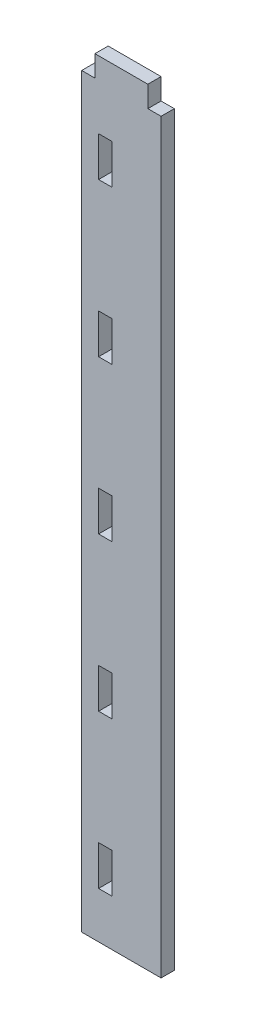
ISO-10303-21;
HEADER;
FILE_DESCRIPTION(('STEP AP214'),'2;1');
FILE_NAME('part.step','',(''),(''),'','','');
FILE_SCHEMA(('AUTOMOTIVE_DESIGN { 1 0 10303 214 1 1 1 1 }'));
ENDSEC;
DATA;
#1=APPLICATION_CONTEXT('core data for automotive mechanical design processes');
#2=APPLICATION_PROTOCOL_DEFINITION('international standard','automotive_design',2000,#1);
#3=PRODUCT_CONTEXT('',#1,'mechanical');
#4=PRODUCT('Part','Part','',(#3));
#5=PRODUCT_RELATED_PRODUCT_CATEGORY('part','',(#4));
#6=PRODUCT_DEFINITION_FORMATION('','',#4);
#7=PRODUCT_DEFINITION_CONTEXT('part definition',#1,'design');
#8=PRODUCT_DEFINITION('design','',#6,#7);
#9=PRODUCT_DEFINITION_SHAPE('','',#8);
#10=(LENGTH_UNIT() NAMED_UNIT(*) SI_UNIT(.MILLI.,.METRE.));
#11=(NAMED_UNIT(*) PLANE_ANGLE_UNIT() SI_UNIT($,.RADIAN.));
#12=(NAMED_UNIT(*) SI_UNIT($,.STERADIAN.) SOLID_ANGLE_UNIT());
#13=UNCERTAINTY_MEASURE_WITH_UNIT(LENGTH_MEASURE(1.E-05),#10,'distance_accuracy_value','');
#14=(GEOMETRIC_REPRESENTATION_CONTEXT(3) GLOBAL_UNCERTAINTY_ASSIGNED_CONTEXT((#13)) GLOBAL_UNIT_ASSIGNED_CONTEXT((#10,
#11,#12)) REPRESENTATION_CONTEXT('',''));
#15=CARTESIAN_POINT('',(0.,0.,0.));
#16=DIRECTION('',(0.,0.,1.));
#17=DIRECTION('',(1.,0.,0.));
#18=AXIS2_PLACEMENT_3D('',#15,#16,#17);
#19=CARTESIAN_POINT('',(0.,0.,5.));
#20=DIRECTION('',(0.,0.,1.));
#21=DIRECTION('',(1.,0.,0.));
#22=AXIS2_PLACEMENT_3D('',#19,#20,#21);
#23=PLANE('',#22);
#24=DIRECTION('',(0.,1.,0.));
#25=VECTOR('',#24,1.);
#26=CARTESIAN_POINT('',(-18.61,75.5,5.));
#27=LINE('',#26,#25);
#28=CARTESIAN_POINT('',(-18.61,75.5,5.));
#29=VERTEX_POINT('',#28);
#30=CARTESIAN_POINT('',(-18.61,90.5,5.));
#31=VERTEX_POINT('',#30);
#32=EDGE_CURVE('E278',#29,#31,#27,.T.);
#33=ORIENTED_EDGE('',*,*,#32,.F.);
#34=DIRECTION('',(1.,0.,0.));
#35=VECTOR('',#34,1.);
#36=CARTESIAN_POINT('',(-23.61,75.5,5.));
#37=LINE('',#36,#35);
#38=CARTESIAN_POINT('',(-23.61,75.5,5.));
#39=VERTEX_POINT('',#38);
#40=EDGE_CURVE('E263',#39,#29,#37,.T.);
#41=ORIENTED_EDGE('',*,*,#40,.F.);
#42=DIRECTION('',(0.,1.,0.));
#43=VECTOR('',#42,1.);
#44=CARTESIAN_POINT('',(-23.61,75.5,5.));
#45=LINE('',#44,#43);
#46=CARTESIAN_POINT('',(-23.61,90.5,5.));
#47=VERTEX_POINT('',#46);
#48=EDGE_CURVE('E258',#39,#47,#45,.T.);
#49=ORIENTED_EDGE('',*,*,#48,.T.);
#50=DIRECTION('',(1.,0.,0.));
#51=VECTOR('',#50,1.);
#52=CARTESIAN_POINT('',(-23.61,90.5,5.));
#53=LINE('',#52,#51);
#54=EDGE_CURVE('E275',#47,#31,#53,.T.);
#55=ORIENTED_EDGE('',*,*,#54,.T.);
#56=EDGE_LOOP('',(#33,#41,#49,#55));
#57=FACE_BOUND('',#56,.T.);
#58=DIRECTION('',(0.,1.,0.));
#59=VECTOR('',#58,1.);
#60=CARTESIAN_POINT('',(-18.61,191.5,5.));
#61=LINE('',#60,#59);
#62=CARTESIAN_POINT('',(-18.61,191.5,5.));
#63=VERTEX_POINT('',#62);
#64=CARTESIAN_POINT('',(-18.61,206.5,5.));
#65=VERTEX_POINT('',#64);
#66=EDGE_CURVE('E342',#63,#65,#61,.T.);
#67=ORIENTED_EDGE('',*,*,#66,.F.);
#68=DIRECTION('',(1.,0.,0.));
#69=VECTOR('',#68,1.);
#70=CARTESIAN_POINT('',(-23.61,191.5,5.));
#71=LINE('',#70,#69);
#72=CARTESIAN_POINT('',(-23.61,191.5,5.));
#73=VERTEX_POINT('',#72);
#74=EDGE_CURVE('E327',#73,#63,#71,.T.);
#75=ORIENTED_EDGE('',*,*,#74,.F.);
#76=DIRECTION('',(0.,1.,0.));
#77=VECTOR('',#76,1.);
#78=CARTESIAN_POINT('',(-23.61,191.5,5.));
#79=LINE('',#78,#77);
#80=CARTESIAN_POINT('',(-23.61,206.5,5.));
#81=VERTEX_POINT('',#80);
#82=EDGE_CURVE('E322',#73,#81,#79,.T.);
#83=ORIENTED_EDGE('',*,*,#82,.T.);
#84=DIRECTION('',(1.,0.,0.));
#85=VECTOR('',#84,1.);
#86=CARTESIAN_POINT('',(-23.61,206.5,5.));
#87=LINE('',#86,#85);
#88=EDGE_CURVE('E339',#81,#65,#87,.T.);
#89=ORIENTED_EDGE('',*,*,#88,.T.);
#90=EDGE_LOOP('',(#67,#75,#83,#89));
#91=FACE_BOUND('',#90,.T.);
#92=DIRECTION('',(0.,-1.,0.));
#93=VECTOR('',#92,1.);
#94=CARTESIAN_POINT('',(-25.,290.,5.));
#95=LINE('',#94,#93);
#96=CARTESIAN_POINT('',(-25.,290.,5.));
#97=VERTEX_POINT('',#96);
#98=CARTESIAN_POINT('',(-25.,282.,5.));
#99=VERTEX_POINT('',#98);
#100=EDGE_CURVE('E379',#97,#99,#95,.T.);
#101=ORIENTED_EDGE('',*,*,#100,.T.);
#102=DIRECTION('',(1.,0.,0.));
#103=VECTOR('',#102,1.);
#104=CARTESIAN_POINT('',(-30.,282.,5.));
#105=LINE('',#104,#103);
#106=CARTESIAN_POINT('',(-30.,282.,5.));
#107=VERTEX_POINT('',#106);
#108=EDGE_CURVE('E377',#107,#99,#105,.T.);
#109=ORIENTED_EDGE('',*,*,#108,.F.);
#110=DIRECTION('',(0.,1.,0.));
#111=VECTOR('',#110,1.);
#112=CARTESIAN_POINT('',(-30.,0.,5.));
#113=LINE('',#112,#111);
#114=CARTESIAN_POINT('',(-30.,0.,5.));
#115=VERTEX_POINT('',#114);
#116=EDGE_CURVE('E420',#115,#107,#113,.T.);
#117=ORIENTED_EDGE('',*,*,#116,.F.);
#118=DIRECTION('',(-1.,0.,0.));
#119=VECTOR('',#118,1.);
#120=CARTESIAN_POINT('',(0.,0.,5.));
#121=LINE('',#120,#119);
#122=CARTESIAN_POINT('',(0.,0.,5.));
#123=VERTEX_POINT('',#122);
#124=EDGE_CURVE('E423',#123,#115,#121,.T.);
#125=ORIENTED_EDGE('',*,*,#124,.F.);
#126=DIRECTION('',(0.,1.,0.));
#127=VECTOR('',#126,1.);
#128=CARTESIAN_POINT('',(0.,0.,5.));
#129=LINE('',#128,#127);
#130=CARTESIAN_POINT('',(0.,282.,5.));
#131=VERTEX_POINT('',#130);
#132=EDGE_CURVE('E413',#123,#131,#129,.T.);
#133=ORIENTED_EDGE('',*,*,#132,.T.);
#134=DIRECTION('',(-1.,0.,0.));
#135=VECTOR('',#134,1.);
#136=CARTESIAN_POINT('',(0.,282.,5.));
#137=LINE('',#136,#135);
#138=CARTESIAN_POINT('',(-5.00000000000001,282.,5.));
#139=VERTEX_POINT('',#138);
#140=EDGE_CURVE('E395',#131,#139,#137,.T.);
#141=ORIENTED_EDGE('',*,*,#140,.T.);
#142=DIRECTION('',(0.,-1.,0.));
#143=VECTOR('',#142,1.);
#144=CARTESIAN_POINT('',(-5.00000000000001,290.,5.));
#145=LINE('',#144,#143);
#146=CARTESIAN_POINT('',(-5.00000000000001,290.,5.));
#147=VERTEX_POINT('',#146);
#148=EDGE_CURVE('E398',#147,#139,#145,.T.);
#149=ORIENTED_EDGE('',*,*,#148,.F.);
#150=DIRECTION('',(-1.,0.,0.));
#151=VECTOR('',#150,1.);
#152=CARTESIAN_POINT('',(0.,290.,5.));
#153=LINE('',#152,#151);
#154=EDGE_CURVE('E416',#147,#97,#153,.T.);
#155=ORIENTED_EDGE('',*,*,#154,.T.);
#156=EDGE_LOOP('',(#101,#109,#117,#125,#133,#141,#149,#155));
#157=FACE_BOUND('',#156,.T.);
#158=DIRECTION('',(0.,1.,0.));
#159=VECTOR('',#158,1.);
#160=CARTESIAN_POINT('',(-18.61,249.5,5.));
#161=LINE('',#160,#159);
#162=CARTESIAN_POINT('',(-18.61,249.5,5.));
#163=VERTEX_POINT('',#162);
#164=CARTESIAN_POINT('',(-18.61,264.5,5.));
#165=VERTEX_POINT('',#164);
#166=EDGE_CURVE('E374',#163,#165,#161,.T.);
#167=ORIENTED_EDGE('',*,*,#166,.F.);
#168=DIRECTION('',(1.,0.,0.));
#169=VECTOR('',#168,1.);
#170=CARTESIAN_POINT('',(-23.61,249.5,5.));
#171=LINE('',#170,#169);
#172=CARTESIAN_POINT('',(-23.61,249.5,5.));
#173=VERTEX_POINT('',#172);
#174=EDGE_CURVE('E359',#173,#163,#171,.T.);
#175=ORIENTED_EDGE('',*,*,#174,.F.);
#176=DIRECTION('',(0.,1.,0.));
#177=VECTOR('',#176,1.);
#178=CARTESIAN_POINT('',(-23.61,249.5,5.));
#179=LINE('',#178,#177);
#180=CARTESIAN_POINT('',(-23.61,264.5,5.));
#181=VERTEX_POINT('',#180);
#182=EDGE_CURVE('E354',#173,#181,#179,.T.);
#183=ORIENTED_EDGE('',*,*,#182,.T.);
#184=DIRECTION('',(1.,0.,0.));
#185=VECTOR('',#184,1.);
#186=CARTESIAN_POINT('',(-23.61,264.5,5.));
#187=LINE('',#186,#185);
#188=EDGE_CURVE('E371',#181,#165,#187,.T.);
#189=ORIENTED_EDGE('',*,*,#188,.T.);
#190=EDGE_LOOP('',(#167,#175,#183,#189));
#191=FACE_BOUND('',#190,.T.);
#192=DIRECTION('',(0.,1.,0.));
#193=VECTOR('',#192,1.);
#194=CARTESIAN_POINT('',(-18.61,133.5,5.));
#195=LINE('',#194,#193);
#196=CARTESIAN_POINT('',(-18.61,133.5,5.));
#197=VERTEX_POINT('',#196);
#198=CARTESIAN_POINT('',(-18.61,148.5,5.));
#199=VERTEX_POINT('',#198);
#200=EDGE_CURVE('E310',#197,#199,#195,.T.);
#201=ORIENTED_EDGE('',*,*,#200,.F.);
#202=DIRECTION('',(1.,0.,0.));
#203=VECTOR('',#202,1.);
#204=CARTESIAN_POINT('',(-23.61,133.5,5.));
#205=LINE('',#204,#203);
#206=CARTESIAN_POINT('',(-23.61,133.5,5.));
#207=VERTEX_POINT('',#206);
#208=EDGE_CURVE('E295',#207,#197,#205,.T.);
#209=ORIENTED_EDGE('',*,*,#208,.F.);
#210=DIRECTION('',(0.,1.,0.));
#211=VECTOR('',#210,1.);
#212=CARTESIAN_POINT('',(-23.61,133.5,5.));
#213=LINE('',#212,#211);
#214=CARTESIAN_POINT('',(-23.61,148.5,5.));
#215=VERTEX_POINT('',#214);
#216=EDGE_CURVE('E290',#207,#215,#213,.T.);
#217=ORIENTED_EDGE('',*,*,#216,.T.);
#218=DIRECTION('',(1.,0.,0.));
#219=VECTOR('',#218,1.);
#220=CARTESIAN_POINT('',(-23.61,148.5,5.));
#221=LINE('',#220,#219);
#222=EDGE_CURVE('E307',#215,#199,#221,.T.);
#223=ORIENTED_EDGE('',*,*,#222,.T.);
#224=EDGE_LOOP('',(#201,#209,#217,#223));
#225=FACE_BOUND('',#224,.T.);
#226=DIRECTION('',(0.,1.,0.));
#227=VECTOR('',#226,1.);
#228=CARTESIAN_POINT('',(-18.61,17.5,5.));
#229=LINE('',#228,#227);
#230=CARTESIAN_POINT('',(-18.61,17.5,5.));
#231=VERTEX_POINT('',#230);
#232=CARTESIAN_POINT('',(-18.61,32.5,5.));
#233=VERTEX_POINT('',#232);
#234=EDGE_CURVE('E246',#231,#233,#229,.T.);
#235=ORIENTED_EDGE('',*,*,#234,.F.);
#236=DIRECTION('',(1.,0.,0.));
#237=VECTOR('',#236,1.);
#238=CARTESIAN_POINT('',(-23.61,17.5,5.));
#239=LINE('',#238,#237);
#240=CARTESIAN_POINT('',(-23.61,17.5,5.));
#241=VERTEX_POINT('',#240);
#242=EDGE_CURVE('E233',#241,#231,#239,.T.);
#243=ORIENTED_EDGE('',*,*,#242,.F.);
#244=DIRECTION('',(0.,1.,0.));
#245=VECTOR('',#244,1.);
#246=CARTESIAN_POINT('',(-23.61,17.5,5.));
#247=LINE('',#246,#245);
#248=CARTESIAN_POINT('',(-23.61,32.5,5.));
#249=VERTEX_POINT('',#248);
#250=EDGE_CURVE('E243',#241,#249,#247,.T.);
#251=ORIENTED_EDGE('',*,*,#250,.T.);
#252=DIRECTION('',(1.,0.,0.));
#253=VECTOR('',#252,1.);
#254=CARTESIAN_POINT('',(-23.61,32.5,5.));
#255=LINE('',#254,#253);
#256=EDGE_CURVE('E48',#249,#233,#255,.T.);
#257=ORIENTED_EDGE('',*,*,#256,.T.);
#258=EDGE_LOOP('',(#235,#243,#251,#257));
#259=FACE_BOUND('',#258,.T.);
#260=ADVANCED_FACE('F33',(#57,#91,#157,#191,#225,#259),#23,.T.);
#261=CARTESIAN_POINT('',(0.,0.,0.));
#262=DIRECTION('',(0.,0.,1.));
#263=DIRECTION('',(1.,0.,0.));
#264=AXIS2_PLACEMENT_3D('',#261,#262,#263);
#265=PLANE('',#264);
#266=DIRECTION('',(1.,0.,0.));
#267=VECTOR('',#266,1.);
#268=CARTESIAN_POINT('',(-23.61,75.5,0.));
#269=LINE('',#268,#267);
#270=CARTESIAN_POINT('',(-23.61,75.5,0.));
#271=VERTEX_POINT('',#270);
#272=CARTESIAN_POINT('',(-18.61,75.5,0.));
#273=VERTEX_POINT('',#272);
#274=EDGE_CURVE('E269',#271,#273,#269,.T.);
#275=ORIENTED_EDGE('',*,*,#274,.T.);
#276=DIRECTION('',(0.,1.,0.));
#277=VECTOR('',#276,1.);
#278=CARTESIAN_POINT('',(-18.61,75.5,0.));
#279=LINE('',#278,#277);
#280=CARTESIAN_POINT('',(-18.61,90.5,0.));
#281=VERTEX_POINT('',#280);
#282=EDGE_CURVE('E266',#273,#281,#279,.T.);
#283=ORIENTED_EDGE('',*,*,#282,.T.);
#284=DIRECTION('',(1.,0.,0.));
#285=VECTOR('',#284,1.);
#286=CARTESIAN_POINT('',(-23.61,90.5,0.));
#287=LINE('',#286,#285);
#288=CARTESIAN_POINT('',(-23.61,90.5,0.));
#289=VERTEX_POINT('',#288);
#290=EDGE_CURVE('E262',#289,#281,#287,.T.);
#291=ORIENTED_EDGE('',*,*,#290,.F.);
#292=DIRECTION('',(0.,1.,0.));
#293=VECTOR('',#292,1.);
#294=CARTESIAN_POINT('',(-23.61,75.5,0.));
#295=LINE('',#294,#293);
#296=EDGE_CURVE('E259',#271,#289,#295,.T.);
#297=ORIENTED_EDGE('',*,*,#296,.F.);
#298=EDGE_LOOP('',(#275,#283,#291,#297));
#299=FACE_BOUND('',#298,.T.);
#300=DIRECTION('',(1.,0.,0.));
#301=VECTOR('',#300,1.);
#302=CARTESIAN_POINT('',(-23.61,191.5,0.));
#303=LINE('',#302,#301);
#304=CARTESIAN_POINT('',(-23.61,191.5,0.));
#305=VERTEX_POINT('',#304);
#306=CARTESIAN_POINT('',(-18.61,191.5,0.));
#307=VERTEX_POINT('',#306);
#308=EDGE_CURVE('E333',#305,#307,#303,.T.);
#309=ORIENTED_EDGE('',*,*,#308,.T.);
#310=DIRECTION('',(0.,1.,0.));
#311=VECTOR('',#310,1.);
#312=CARTESIAN_POINT('',(-18.61,191.5,0.));
#313=LINE('',#312,#311);
#314=CARTESIAN_POINT('',(-18.61,206.5,0.));
#315=VERTEX_POINT('',#314);
#316=EDGE_CURVE('E330',#307,#315,#313,.T.);
#317=ORIENTED_EDGE('',*,*,#316,.T.);
#318=DIRECTION('',(1.,0.,0.));
#319=VECTOR('',#318,1.);
#320=CARTESIAN_POINT('',(-23.61,206.5,0.));
#321=LINE('',#320,#319);
#322=CARTESIAN_POINT('',(-23.61,206.5,0.));
#323=VERTEX_POINT('',#322);
#324=EDGE_CURVE('E326',#323,#315,#321,.T.);
#325=ORIENTED_EDGE('',*,*,#324,.F.);
#326=DIRECTION('',(0.,1.,0.));
#327=VECTOR('',#326,1.);
#328=CARTESIAN_POINT('',(-23.61,191.5,0.));
#329=LINE('',#328,#327);
#330=EDGE_CURVE('E323',#305,#323,#329,.T.);
#331=ORIENTED_EDGE('',*,*,#330,.F.);
#332=EDGE_LOOP('',(#309,#317,#325,#331));
#333=FACE_BOUND('',#332,.T.);
#334=DIRECTION('',(1.,0.,0.));
#335=VECTOR('',#334,1.);
#336=CARTESIAN_POINT('',(-30.,282.,0.));
#337=LINE('',#336,#335);
#338=CARTESIAN_POINT('',(-30.,282.,0.));
#339=VERTEX_POINT('',#338);
#340=CARTESIAN_POINT('',(-25.,282.,0.));
#341=VERTEX_POINT('',#340);
#342=EDGE_CURVE('E368',#339,#341,#337,.T.);
#343=ORIENTED_EDGE('',*,*,#342,.T.);
#344=DIRECTION('',(0.,-1.,0.));
#345=VECTOR('',#344,1.);
#346=CARTESIAN_POINT('',(-25.,290.,0.));
#347=LINE('',#346,#345);
#348=CARTESIAN_POINT('',(-25.,290.,0.));
#349=VERTEX_POINT('',#348);
#350=EDGE_CURVE('E380',#349,#341,#347,.T.);
#351=ORIENTED_EDGE('',*,*,#350,.F.);
#352=DIRECTION('',(-1.,0.,0.));
#353=VECTOR('',#352,1.);
#354=CARTESIAN_POINT('',(0.,290.,0.));
#355=LINE('',#354,#353);
#356=CARTESIAN_POINT('',(-5.00000000000001,290.,0.));
#357=VERTEX_POINT('',#356);
#358=EDGE_CURVE('E428',#357,#349,#355,.T.);
#359=ORIENTED_EDGE('',*,*,#358,.F.);
#360=DIRECTION('',(0.,-1.,0.));
#361=VECTOR('',#360,1.);
#362=CARTESIAN_POINT('',(-5.00000000000001,290.,0.));
#363=LINE('',#362,#361);
#364=CARTESIAN_POINT('',(-5.00000000000001,282.,0.));
#365=VERTEX_POINT('',#364);
#366=EDGE_CURVE('E399',#357,#365,#363,.T.);
#367=ORIENTED_EDGE('',*,*,#366,.T.);
#368=DIRECTION('',(-1.,0.,0.));
#369=VECTOR('',#368,1.);
#370=CARTESIAN_POINT('',(0.,282.,0.));
#371=LINE('',#370,#369);
#372=CARTESIAN_POINT('',(0.,282.,0.));
#373=VERTEX_POINT('',#372);
#374=EDGE_CURVE('E394',#373,#365,#371,.T.);
#375=ORIENTED_EDGE('',*,*,#374,.F.);
#376=DIRECTION('',(0.,1.,0.));
#377=VECTOR('',#376,1.);
#378=CARTESIAN_POINT('',(0.,0.,0.));
#379=LINE('',#378,#377);
#380=CARTESIAN_POINT('',(0.,0.,0.));
#381=VERTEX_POINT('',#380);
#382=EDGE_CURVE('E409',#381,#373,#379,.T.);
#383=ORIENTED_EDGE('',*,*,#382,.F.);
#384=DIRECTION('',(-1.,0.,0.));
#385=VECTOR('',#384,1.);
#386=CARTESIAN_POINT('',(0.,0.,0.));
#387=LINE('',#386,#385);
#388=CARTESIAN_POINT('',(-30.,0.,0.));
#389=VERTEX_POINT('',#388);
#390=EDGE_CURVE('E417',#381,#389,#387,.T.);
#391=ORIENTED_EDGE('',*,*,#390,.T.);
#392=DIRECTION('',(0.,1.,0.));
#393=VECTOR('',#392,1.);
#394=CARTESIAN_POINT('',(-30.,0.,0.));
#395=LINE('',#394,#393);
#396=EDGE_CURVE('E431',#389,#339,#395,.T.);
#397=ORIENTED_EDGE('',*,*,#396,.T.);
#398=EDGE_LOOP('',(#343,#351,#359,#367,#375,#383,#391,#397));
#399=FACE_BOUND('',#398,.T.);
#400=DIRECTION('',(1.,0.,0.));
#401=VECTOR('',#400,1.);
#402=CARTESIAN_POINT('',(-23.61,249.5,0.));
#403=LINE('',#402,#401);
#404=CARTESIAN_POINT('',(-23.61,249.5,0.));
#405=VERTEX_POINT('',#404);
#406=CARTESIAN_POINT('',(-18.61,249.5,0.));
#407=VERTEX_POINT('',#406);
#408=EDGE_CURVE('E365',#405,#407,#403,.T.);
#409=ORIENTED_EDGE('',*,*,#408,.T.);
#410=DIRECTION('',(0.,1.,0.));
#411=VECTOR('',#410,1.);
#412=CARTESIAN_POINT('',(-18.61,249.5,0.));
#413=LINE('',#412,#411);
#414=CARTESIAN_POINT('',(-18.61,264.5,0.));
#415=VERTEX_POINT('',#414);
#416=EDGE_CURVE('E362',#407,#415,#413,.T.);
#417=ORIENTED_EDGE('',*,*,#416,.T.);
#418=DIRECTION('',(1.,0.,0.));
#419=VECTOR('',#418,1.);
#420=CARTESIAN_POINT('',(-23.61,264.5,0.));
#421=LINE('',#420,#419);
#422=CARTESIAN_POINT('',(-23.61,264.5,0.));
#423=VERTEX_POINT('',#422);
#424=EDGE_CURVE('E358',#423,#415,#421,.T.);
#425=ORIENTED_EDGE('',*,*,#424,.F.);
#426=DIRECTION('',(0.,1.,0.));
#427=VECTOR('',#426,1.);
#428=CARTESIAN_POINT('',(-23.61,249.5,0.));
#429=LINE('',#428,#427);
#430=EDGE_CURVE('E355',#405,#423,#429,.T.);
#431=ORIENTED_EDGE('',*,*,#430,.F.);
#432=EDGE_LOOP('',(#409,#417,#425,#431));
#433=FACE_BOUND('',#432,.T.);
#434=DIRECTION('',(1.,0.,0.));
#435=VECTOR('',#434,1.);
#436=CARTESIAN_POINT('',(-23.61,133.5,0.));
#437=LINE('',#436,#435);
#438=CARTESIAN_POINT('',(-23.61,133.5,0.));
#439=VERTEX_POINT('',#438);
#440=CARTESIAN_POINT('',(-18.61,133.5,0.));
#441=VERTEX_POINT('',#440);
#442=EDGE_CURVE('E301',#439,#441,#437,.T.);
#443=ORIENTED_EDGE('',*,*,#442,.T.);
#444=DIRECTION('',(0.,1.,0.));
#445=VECTOR('',#444,1.);
#446=CARTESIAN_POINT('',(-18.61,133.5,0.));
#447=LINE('',#446,#445);
#448=CARTESIAN_POINT('',(-18.61,148.5,0.));
#449=VERTEX_POINT('',#448);
#450=EDGE_CURVE('E298',#441,#449,#447,.T.);
#451=ORIENTED_EDGE('',*,*,#450,.T.);
#452=DIRECTION('',(1.,0.,0.));
#453=VECTOR('',#452,1.);
#454=CARTESIAN_POINT('',(-23.61,148.5,0.));
#455=LINE('',#454,#453);
#456=CARTESIAN_POINT('',(-23.61,148.5,0.));
#457=VERTEX_POINT('',#456);
#458=EDGE_CURVE('E294',#457,#449,#455,.T.);
#459=ORIENTED_EDGE('',*,*,#458,.F.);
#460=DIRECTION('',(0.,1.,0.));
#461=VECTOR('',#460,1.);
#462=CARTESIAN_POINT('',(-23.61,133.5,0.));
#463=LINE('',#462,#461);
#464=EDGE_CURVE('E291',#439,#457,#463,.T.);
#465=ORIENTED_EDGE('',*,*,#464,.F.);
#466=EDGE_LOOP('',(#443,#451,#459,#465));
#467=FACE_BOUND('',#466,.T.);
#468=DIRECTION('',(1.,0.,0.));
#469=VECTOR('',#468,1.);
#470=CARTESIAN_POINT('',(-23.61,17.5,0.));
#471=LINE('',#470,#469);
#472=CARTESIAN_POINT('',(-23.61,17.5,0.));
#473=VERTEX_POINT('',#472);
#474=CARTESIAN_POINT('',(-18.61,17.5,0.));
#475=VERTEX_POINT('',#474);
#476=EDGE_CURVE('E56',#473,#475,#471,.T.);
#477=ORIENTED_EDGE('',*,*,#476,.T.);
#478=DIRECTION('',(0.,1.,0.));
#479=VECTOR('',#478,1.);
#480=CARTESIAN_POINT('',(-18.61,17.5,0.));
#481=LINE('',#480,#479);
#482=CARTESIAN_POINT('',(-18.61,32.5,0.));
#483=VERTEX_POINT('',#482);
#484=EDGE_CURVE('E236',#475,#483,#481,.T.);
#485=ORIENTED_EDGE('',*,*,#484,.T.);
#486=DIRECTION('',(1.,0.,0.));
#487=VECTOR('',#486,1.);
#488=CARTESIAN_POINT('',(-23.61,32.5,0.));
#489=LINE('',#488,#487);
#490=CARTESIAN_POINT('',(-23.61,32.5,0.));
#491=VERTEX_POINT('',#490);
#492=EDGE_CURVE('E221',#491,#483,#489,.T.);
#493=ORIENTED_EDGE('',*,*,#492,.F.);
#494=DIRECTION('',(0.,1.,0.));
#495=VECTOR('',#494,1.);
#496=CARTESIAN_POINT('',(-23.61,17.5,0.));
#497=LINE('',#496,#495);
#498=EDGE_CURVE('E230',#473,#491,#497,.T.);
#499=ORIENTED_EDGE('',*,*,#498,.F.);
#500=EDGE_LOOP('',(#477,#485,#493,#499));
#501=FACE_BOUND('',#500,.T.);
#502=ADVANCED_FACE('F235',(#299,#333,#399,#433,#467,#501),#265,.F.);
#503=CARTESIAN_POINT('',(-30.,0.,5.));
#504=DIRECTION('',(-1.,0.,0.));
#505=DIRECTION('',(0.,-1.,0.));
#506=AXIS2_PLACEMENT_3D('',#503,#504,#505);
#507=PLANE('',#506);
#508=ORIENTED_EDGE('',*,*,#116,.T.);
#509=DIRECTION('',(0.,0.,-1.));
#510=VECTOR('',#509,1.);
#511=CARTESIAN_POINT('',(-30.,282.,5.));
#512=LINE('',#511,#510);
#513=EDGE_CURVE('E391',#107,#339,#512,.T.);
#514=ORIENTED_EDGE('',*,*,#513,.T.);
#515=ORIENTED_EDGE('',*,*,#396,.F.);
#516=DIRECTION('',(0.,0.,-1.));
#517=VECTOR('',#516,1.);
#518=CARTESIAN_POINT('',(-30.,0.,5.));
#519=LINE('',#518,#517);
#520=EDGE_CURVE('E11',#115,#389,#519,.T.);
#521=ORIENTED_EDGE('',*,*,#520,.F.);
#522=EDGE_LOOP('',(#508,#514,#515,#521));
#523=FACE_BOUND('',#522,.T.);
#524=ADVANCED_FACE('F449',(#523),#507,.T.);
#525=CARTESIAN_POINT('',(0.,290.,5.));
#526=DIRECTION('',(0.,-1.,0.));
#527=DIRECTION('',(0.,0.,-1.));
#528=AXIS2_PLACEMENT_3D('',#525,#526,#527);
#529=PLANE('',#528);
#530=ORIENTED_EDGE('',*,*,#358,.T.);
#531=DIRECTION('',(0.,0.,-1.));
#532=VECTOR('',#531,1.);
#533=CARTESIAN_POINT('',(-25.,290.,5.));
#534=LINE('',#533,#532);
#535=EDGE_CURVE('E383',#97,#349,#534,.T.);
#536=ORIENTED_EDGE('',*,*,#535,.F.);
#537=ORIENTED_EDGE('',*,*,#154,.F.);
#538=DIRECTION('',(0.,0.,-1.));
#539=VECTOR('',#538,1.);
#540=CARTESIAN_POINT('',(-5.00000000000001,290.,5.));
#541=LINE('',#540,#539);
#542=EDGE_CURVE('E406',#147,#357,#541,.T.);
#543=ORIENTED_EDGE('',*,*,#542,.T.);
#544=EDGE_LOOP('',(#530,#536,#537,#543));
#545=FACE_BOUND('',#544,.T.);
#546=ADVANCED_FACE('F461',(#545),#529,.F.);
#547=CARTESIAN_POINT('',(0.,0.,5.));
#548=DIRECTION('',(-1.,0.,0.));
#549=DIRECTION('',(0.,-1.,0.));
#550=AXIS2_PLACEMENT_3D('',#547,#548,#549);
#551=PLANE('',#550);
#552=ORIENTED_EDGE('',*,*,#382,.T.);
#553=DIRECTION('',(0.,0.,-1.));
#554=VECTOR('',#553,1.);
#555=CARTESIAN_POINT('',(0.,282.,5.));
#556=LINE('',#555,#554);
#557=EDGE_CURVE('E401',#131,#373,#556,.T.);
#558=ORIENTED_EDGE('',*,*,#557,.F.);
#559=ORIENTED_EDGE('',*,*,#132,.F.);
#560=DIRECTION('',(0.,0.,-1.));
#561=VECTOR('',#560,1.);
#562=CARTESIAN_POINT('',(0.,0.,5.));
#563=LINE('',#562,#561);
#564=EDGE_CURVE('E41',#123,#381,#563,.T.);
#565=ORIENTED_EDGE('',*,*,#564,.T.);
#566=EDGE_LOOP('',(#552,#558,#559,#565));
#567=FACE_BOUND('',#566,.T.);
#568=ADVANCED_FACE('F35',(#567),#551,.F.);
#569=CARTESIAN_POINT('',(0.,0.,5.));
#570=DIRECTION('',(0.,-1.,0.));
#571=DIRECTION('',(1.,0.,0.));
#572=AXIS2_PLACEMENT_3D('',#569,#570,#571);
#573=PLANE('',#572);
#574=ORIENTED_EDGE('',*,*,#390,.F.);
#575=ORIENTED_EDGE('',*,*,#564,.F.);
#576=ORIENTED_EDGE('',*,*,#124,.T.);
#577=ORIENTED_EDGE('',*,*,#520,.T.);
#578=EDGE_LOOP('',(#574,#575,#576,#577));
#579=FACE_BOUND('',#578,.T.);
#580=ADVANCED_FACE('F445',(#579),#573,.T.);
#581=CARTESIAN_POINT('',(-5.00000000000001,290.,5.));
#582=DIRECTION('',(1.,0.,0.));
#583=DIRECTION('',(0.,1.,0.));
#584=AXIS2_PLACEMENT_3D('',#581,#582,#583);
#585=PLANE('',#584);
#586=ORIENTED_EDGE('',*,*,#366,.F.);
#587=ORIENTED_EDGE('',*,*,#542,.F.);
#588=ORIENTED_EDGE('',*,*,#148,.T.);
#589=DIRECTION('',(0.,0.,-1.));
#590=VECTOR('',#589,1.);
#591=CARTESIAN_POINT('',(-5.00000000000001,282.,5.));
#592=LINE('',#591,#590);
#593=EDGE_CURVE('E410',#139,#365,#592,.T.);
#594=ORIENTED_EDGE('',*,*,#593,.T.);
#595=EDGE_LOOP('',(#586,#587,#588,#594));
#596=FACE_BOUND('',#595,.T.);
#597=ADVANCED_FACE('F467',(#596),#585,.T.);
#598=CARTESIAN_POINT('',(0.,282.,5.));
#599=DIRECTION('',(0.,-1.,0.));
#600=DIRECTION('',(0.,0.,-1.));
#601=AXIS2_PLACEMENT_3D('',#598,#599,#600);
#602=PLANE('',#601);
#603=ORIENTED_EDGE('',*,*,#374,.T.);
#604=ORIENTED_EDGE('',*,*,#593,.F.);
#605=ORIENTED_EDGE('',*,*,#140,.F.);
#606=ORIENTED_EDGE('',*,*,#557,.T.);
#607=EDGE_LOOP('',(#603,#604,#605,#606));
#608=FACE_BOUND('',#607,.T.);
#609=ADVANCED_FACE('F469',(#608),#602,.F.);
#610=CARTESIAN_POINT('',(-30.,282.,5.));
#611=DIRECTION('',(0.,1.,0.));
#612=DIRECTION('',(0.,0.,1.));
#613=AXIS2_PLACEMENT_3D('',#610,#611,#612);
#614=PLANE('',#613);
#615=ORIENTED_EDGE('',*,*,#342,.F.);
#616=ORIENTED_EDGE('',*,*,#513,.F.);
#617=ORIENTED_EDGE('',*,*,#108,.T.);
#618=DIRECTION('',(0.,0.,-1.));
#619=VECTOR('',#618,1.);
#620=CARTESIAN_POINT('',(-25.,282.,5.));
#621=LINE('',#620,#619);
#622=EDGE_CURVE('E389',#99,#341,#621,.T.);
#623=ORIENTED_EDGE('',*,*,#622,.T.);
#624=EDGE_LOOP('',(#615,#616,#617,#623));
#625=FACE_BOUND('',#624,.T.);
#626=ADVANCED_FACE('F453',(#625),#614,.T.);
#627=CARTESIAN_POINT('',(-25.,290.,5.));
#628=DIRECTION('',(1.,0.,0.));
#629=DIRECTION('',(0.,1.,0.));
#630=AXIS2_PLACEMENT_3D('',#627,#628,#629);
#631=PLANE('',#630);
#632=ORIENTED_EDGE('',*,*,#350,.T.);
#633=ORIENTED_EDGE('',*,*,#622,.F.);
#634=ORIENTED_EDGE('',*,*,#100,.F.);
#635=ORIENTED_EDGE('',*,*,#535,.T.);
#636=EDGE_LOOP('',(#632,#633,#634,#635));
#637=FACE_BOUND('',#636,.T.);
#638=ADVANCED_FACE('F457',(#637),#631,.F.);
#639=CARTESIAN_POINT('',(-23.61,249.5,5.));
#640=DIRECTION('',(0.,1.,0.));
#641=DIRECTION('',(0.,0.,1.));
#642=AXIS2_PLACEMENT_3D('',#639,#640,#641);
#643=PLANE('',#642);
#644=ORIENTED_EDGE('',*,*,#408,.F.);
#645=DIRECTION('',(0.,0.,-1.));
#646=VECTOR('',#645,1.);
#647=CARTESIAN_POINT('',(-23.61,249.5,5.));
#648=LINE('',#647,#646);
#649=EDGE_CURVE('E351',#173,#405,#648,.T.);
#650=ORIENTED_EDGE('',*,*,#649,.F.);
#651=ORIENTED_EDGE('',*,*,#174,.T.);
#652=DIRECTION('',(0.,0.,-1.));
#653=VECTOR('',#652,1.);
#654=CARTESIAN_POINT('',(-18.61,249.5,5.));
#655=LINE('',#654,#653);
#656=EDGE_CURVE('E336',#163,#407,#655,.T.);
#657=ORIENTED_EDGE('',*,*,#656,.T.);
#658=EDGE_LOOP('',(#644,#650,#651,#657));
#659=FACE_BOUND('',#658,.T.);
#660=ADVANCED_FACE('F545',(#659),#643,.T.);
#661=CARTESIAN_POINT('',(-18.61,249.5,5.));
#662=DIRECTION('',(-1.,0.,0.));
#663=DIRECTION('',(0.,0.,1.));
#664=AXIS2_PLACEMENT_3D('',#661,#662,#663);
#665=PLANE('',#664);
#666=ORIENTED_EDGE('',*,*,#416,.F.);
#667=ORIENTED_EDGE('',*,*,#656,.F.);
#668=ORIENTED_EDGE('',*,*,#166,.T.);
#669=DIRECTION('',(0.,0.,-1.));
#670=VECTOR('',#669,1.);
#671=CARTESIAN_POINT('',(-18.61,264.5,5.));
#672=LINE('',#671,#670);
#673=EDGE_CURVE('E347',#165,#415,#672,.T.);
#674=ORIENTED_EDGE('',*,*,#673,.T.);
#675=EDGE_LOOP('',(#666,#667,#668,#674));
#676=FACE_BOUND('',#675,.T.);
#677=ADVANCED_FACE('F554',(#676),#665,.T.);
#678=CARTESIAN_POINT('',(-23.61,264.5,5.));
#679=DIRECTION('',(0.,1.,0.));
#680=DIRECTION('',(0.,0.,1.));
#681=AXIS2_PLACEMENT_3D('',#678,#679,#680);
#682=PLANE('',#681);
#683=ORIENTED_EDGE('',*,*,#424,.T.);
#684=ORIENTED_EDGE('',*,*,#673,.F.);
#685=ORIENTED_EDGE('',*,*,#188,.F.);
#686=DIRECTION('',(0.,0.,-1.));
#687=VECTOR('',#686,1.);
#688=CARTESIAN_POINT('',(-23.61,264.5,5.));
#689=LINE('',#688,#687);
#690=EDGE_CURVE('E349',#181,#423,#689,.T.);
#691=ORIENTED_EDGE('',*,*,#690,.T.);
#692=EDGE_LOOP('',(#683,#684,#685,#691));
#693=FACE_BOUND('',#692,.T.);
#694=ADVANCED_FACE('F564',(#693),#682,.F.);
#695=CARTESIAN_POINT('',(-23.61,249.5,5.));
#696=DIRECTION('',(-1.,0.,0.));
#697=DIRECTION('',(0.,0.,1.));
#698=AXIS2_PLACEMENT_3D('',#695,#696,#697);
#699=PLANE('',#698);
#700=ORIENTED_EDGE('',*,*,#430,.T.);
#701=ORIENTED_EDGE('',*,*,#690,.F.);
#702=ORIENTED_EDGE('',*,*,#182,.F.);
#703=ORIENTED_EDGE('',*,*,#649,.T.);
#704=EDGE_LOOP('',(#700,#701,#702,#703));
#705=FACE_BOUND('',#704,.T.);
#706=ADVANCED_FACE('F574',(#705),#699,.F.);
#707=CARTESIAN_POINT('',(-23.61,191.5,5.));
#708=DIRECTION('',(0.,1.,0.));
#709=DIRECTION('',(0.,0.,1.));
#710=AXIS2_PLACEMENT_3D('',#707,#708,#709);
#711=PLANE('',#710);
#712=ORIENTED_EDGE('',*,*,#308,.F.);
#713=DIRECTION('',(0.,0.,-1.));
#714=VECTOR('',#713,1.);
#715=CARTESIAN_POINT('',(-23.61,191.5,5.));
#716=LINE('',#715,#714);
#717=EDGE_CURVE('E319',#73,#305,#716,.T.);
#718=ORIENTED_EDGE('',*,*,#717,.F.);
#719=ORIENTED_EDGE('',*,*,#74,.T.);
#720=DIRECTION('',(0.,0.,-1.));
#721=VECTOR('',#720,1.);
#722=CARTESIAN_POINT('',(-18.61,191.5,5.));
#723=LINE('',#722,#721);
#724=EDGE_CURVE('E304',#63,#307,#723,.T.);
#725=ORIENTED_EDGE('',*,*,#724,.T.);
#726=EDGE_LOOP('',(#712,#718,#719,#725));
#727=FACE_BOUND('',#726,.T.);
#728=ADVANCED_FACE('F584',(#727),#711,.T.);
#729=CARTESIAN_POINT('',(-18.61,191.5,5.));
#730=DIRECTION('',(-1.,0.,0.));
#731=DIRECTION('',(0.,0.,1.));
#732=AXIS2_PLACEMENT_3D('',#729,#730,#731);
#733=PLANE('',#732);
#734=ORIENTED_EDGE('',*,*,#316,.F.);
#735=ORIENTED_EDGE('',*,*,#724,.F.);
#736=ORIENTED_EDGE('',*,*,#66,.T.);
#737=DIRECTION('',(0.,0.,-1.));
#738=VECTOR('',#737,1.);
#739=CARTESIAN_POINT('',(-18.61,206.5,5.));
#740=LINE('',#739,#738);
#741=EDGE_CURVE('E315',#65,#315,#740,.T.);
#742=ORIENTED_EDGE('',*,*,#741,.T.);
#743=EDGE_LOOP('',(#734,#735,#736,#742));
#744=FACE_BOUND('',#743,.T.);
#745=ADVANCED_FACE('F594',(#744),#733,.T.);
#746=CARTESIAN_POINT('',(-23.61,206.5,5.));
#747=DIRECTION('',(0.,1.,0.));
#748=DIRECTION('',(0.,0.,1.));
#749=AXIS2_PLACEMENT_3D('',#746,#747,#748);
#750=PLANE('',#749);
#751=ORIENTED_EDGE('',*,*,#324,.T.);
#752=ORIENTED_EDGE('',*,*,#741,.F.);
#753=ORIENTED_EDGE('',*,*,#88,.F.);
#754=DIRECTION('',(0.,0.,-1.));
#755=VECTOR('',#754,1.);
#756=CARTESIAN_POINT('',(-23.61,206.5,5.));
#757=LINE('',#756,#755);
#758=EDGE_CURVE('E317',#81,#323,#757,.T.);
#759=ORIENTED_EDGE('',*,*,#758,.T.);
#760=EDGE_LOOP('',(#751,#752,#753,#759));
#761=FACE_BOUND('',#760,.T.);
#762=ADVANCED_FACE('F604',(#761),#750,.F.);
#763=CARTESIAN_POINT('',(-23.61,191.5,5.));
#764=DIRECTION('',(-1.,0.,0.));
#765=DIRECTION('',(0.,0.,1.));
#766=AXIS2_PLACEMENT_3D('',#763,#764,#765);
#767=PLANE('',#766);
#768=ORIENTED_EDGE('',*,*,#330,.T.);
#769=ORIENTED_EDGE('',*,*,#758,.F.);
#770=ORIENTED_EDGE('',*,*,#82,.F.);
#771=ORIENTED_EDGE('',*,*,#717,.T.);
#772=EDGE_LOOP('',(#768,#769,#770,#771));
#773=FACE_BOUND('',#772,.T.);
#774=ADVANCED_FACE('F614',(#773),#767,.F.);
#775=CARTESIAN_POINT('',(-23.61,133.5,5.));
#776=DIRECTION('',(0.,1.,0.));
#777=DIRECTION('',(0.,0.,1.));
#778=AXIS2_PLACEMENT_3D('',#775,#776,#777);
#779=PLANE('',#778);
#780=ORIENTED_EDGE('',*,*,#442,.F.);
#781=DIRECTION('',(0.,0.,-1.));
#782=VECTOR('',#781,1.);
#783=CARTESIAN_POINT('',(-23.61,133.5,5.));
#784=LINE('',#783,#782);
#785=EDGE_CURVE('E287',#207,#439,#784,.T.);
#786=ORIENTED_EDGE('',*,*,#785,.F.);
#787=ORIENTED_EDGE('',*,*,#208,.T.);
#788=DIRECTION('',(0.,0.,-1.));
#789=VECTOR('',#788,1.);
#790=CARTESIAN_POINT('',(-18.61,133.5,5.));
#791=LINE('',#790,#789);
#792=EDGE_CURVE('E272',#197,#441,#791,.T.);
#793=ORIENTED_EDGE('',*,*,#792,.T.);
#794=EDGE_LOOP('',(#780,#786,#787,#793));
#795=FACE_BOUND('',#794,.T.);
#796=ADVANCED_FACE('F624',(#795),#779,.T.);
#797=CARTESIAN_POINT('',(-18.61,133.5,5.));
#798=DIRECTION('',(-1.,0.,0.));
#799=DIRECTION('',(0.,0.,1.));
#800=AXIS2_PLACEMENT_3D('',#797,#798,#799);
#801=PLANE('',#800);
#802=ORIENTED_EDGE('',*,*,#450,.F.);
#803=ORIENTED_EDGE('',*,*,#792,.F.);
#804=ORIENTED_EDGE('',*,*,#200,.T.);
#805=DIRECTION('',(0.,0.,-1.));
#806=VECTOR('',#805,1.);
#807=CARTESIAN_POINT('',(-18.61,148.5,5.));
#808=LINE('',#807,#806);
#809=EDGE_CURVE('E283',#199,#449,#808,.T.);
#810=ORIENTED_EDGE('',*,*,#809,.T.);
#811=EDGE_LOOP('',(#802,#803,#804,#810));
#812=FACE_BOUND('',#811,.T.);
#813=ADVANCED_FACE('F634',(#812),#801,.T.);
#814=CARTESIAN_POINT('',(-23.61,148.5,5.));
#815=DIRECTION('',(0.,1.,0.));
#816=DIRECTION('',(0.,0.,1.));
#817=AXIS2_PLACEMENT_3D('',#814,#815,#816);
#818=PLANE('',#817);
#819=ORIENTED_EDGE('',*,*,#458,.T.);
#820=ORIENTED_EDGE('',*,*,#809,.F.);
#821=ORIENTED_EDGE('',*,*,#222,.F.);
#822=DIRECTION('',(0.,0.,-1.));
#823=VECTOR('',#822,1.);
#824=CARTESIAN_POINT('',(-23.61,148.5,5.));
#825=LINE('',#824,#823);
#826=EDGE_CURVE('E285',#215,#457,#825,.T.);
#827=ORIENTED_EDGE('',*,*,#826,.T.);
#828=EDGE_LOOP('',(#819,#820,#821,#827));
#829=FACE_BOUND('',#828,.T.);
#830=ADVANCED_FACE('F644',(#829),#818,.F.);
#831=CARTESIAN_POINT('',(-23.61,133.5,5.));
#832=DIRECTION('',(-1.,0.,0.));
#833=DIRECTION('',(0.,0.,1.));
#834=AXIS2_PLACEMENT_3D('',#831,#832,#833);
#835=PLANE('',#834);
#836=ORIENTED_EDGE('',*,*,#464,.T.);
#837=ORIENTED_EDGE('',*,*,#826,.F.);
#838=ORIENTED_EDGE('',*,*,#216,.F.);
#839=ORIENTED_EDGE('',*,*,#785,.T.);
#840=EDGE_LOOP('',(#836,#837,#838,#839));
#841=FACE_BOUND('',#840,.T.);
#842=ADVANCED_FACE('F654',(#841),#835,.F.);
#843=CARTESIAN_POINT('',(-23.61,75.5,5.));
#844=DIRECTION('',(0.,1.,0.));
#845=DIRECTION('',(0.,0.,1.));
#846=AXIS2_PLACEMENT_3D('',#843,#844,#845);
#847=PLANE('',#846);
#848=ORIENTED_EDGE('',*,*,#274,.F.);
#849=DIRECTION('',(0.,0.,-1.));
#850=VECTOR('',#849,1.);
#851=CARTESIAN_POINT('',(-23.61,75.5,5.));
#852=LINE('',#851,#850);
#853=EDGE_CURVE('E255',#39,#271,#852,.T.);
#854=ORIENTED_EDGE('',*,*,#853,.F.);
#855=ORIENTED_EDGE('',*,*,#40,.T.);
#856=DIRECTION('',(0.,0.,-1.));
#857=VECTOR('',#856,1.);
#858=CARTESIAN_POINT('',(-18.61,75.5,5.));
#859=LINE('',#858,#857);
#860=EDGE_CURVE('E242',#29,#273,#859,.T.);
#861=ORIENTED_EDGE('',*,*,#860,.T.);
#862=EDGE_LOOP('',(#848,#854,#855,#861));
#863=FACE_BOUND('',#862,.T.);
#864=ADVANCED_FACE('F664',(#863),#847,.T.);
#865=CARTESIAN_POINT('',(-18.61,75.5,5.));
#866=DIRECTION('',(-1.,0.,0.));
#867=DIRECTION('',(0.,0.,1.));
#868=AXIS2_PLACEMENT_3D('',#865,#866,#867);
#869=PLANE('',#868);
#870=ORIENTED_EDGE('',*,*,#282,.F.);
#871=ORIENTED_EDGE('',*,*,#860,.F.);
#872=ORIENTED_EDGE('',*,*,#32,.T.);
#873=DIRECTION('',(0.,0.,-1.));
#874=VECTOR('',#873,1.);
#875=CARTESIAN_POINT('',(-18.61,90.5,5.));
#876=LINE('',#875,#874);
#877=EDGE_CURVE('E251',#31,#281,#876,.T.);
#878=ORIENTED_EDGE('',*,*,#877,.T.);
#879=EDGE_LOOP('',(#870,#871,#872,#878));
#880=FACE_BOUND('',#879,.T.);
#881=ADVANCED_FACE('F674',(#880),#869,.T.);
#882=CARTESIAN_POINT('',(-23.61,90.5,5.));
#883=DIRECTION('',(0.,1.,0.));
#884=DIRECTION('',(0.,0.,1.));
#885=AXIS2_PLACEMENT_3D('',#882,#883,#884);
#886=PLANE('',#885);
#887=ORIENTED_EDGE('',*,*,#290,.T.);
#888=ORIENTED_EDGE('',*,*,#877,.F.);
#889=ORIENTED_EDGE('',*,*,#54,.F.);
#890=DIRECTION('',(0.,0.,-1.));
#891=VECTOR('',#890,1.);
#892=CARTESIAN_POINT('',(-23.61,90.5,5.));
#893=LINE('',#892,#891);
#894=EDGE_CURVE('E253',#47,#289,#893,.T.);
#895=ORIENTED_EDGE('',*,*,#894,.T.);
#896=EDGE_LOOP('',(#887,#888,#889,#895));
#897=FACE_BOUND('',#896,.T.);
#898=ADVANCED_FACE('F684',(#897),#886,.F.);
#899=CARTESIAN_POINT('',(-23.61,75.5,5.));
#900=DIRECTION('',(-1.,0.,0.));
#901=DIRECTION('',(0.,0.,1.));
#902=AXIS2_PLACEMENT_3D('',#899,#900,#901);
#903=PLANE('',#902);
#904=ORIENTED_EDGE('',*,*,#296,.T.);
#905=ORIENTED_EDGE('',*,*,#894,.F.);
#906=ORIENTED_EDGE('',*,*,#48,.F.);
#907=ORIENTED_EDGE('',*,*,#853,.T.);
#908=EDGE_LOOP('',(#904,#905,#906,#907));
#909=FACE_BOUND('',#908,.T.);
#910=ADVANCED_FACE('F694',(#909),#903,.F.);
#911=CARTESIAN_POINT('',(-23.61,17.5,5.));
#912=DIRECTION('',(0.,1.,0.));
#913=DIRECTION('',(0.,0.,1.));
#914=AXIS2_PLACEMENT_3D('',#911,#912,#913);
#915=PLANE('',#914);
#916=ORIENTED_EDGE('',*,*,#476,.F.);
#917=DIRECTION('',(0.,0.,-1.));
#918=VECTOR('',#917,1.);
#919=CARTESIAN_POINT('',(-23.61,17.5,5.));
#920=LINE('',#919,#918);
#921=EDGE_CURVE('E226',#241,#473,#920,.T.);
#922=ORIENTED_EDGE('',*,*,#921,.F.);
#923=ORIENTED_EDGE('',*,*,#242,.T.);
#924=DIRECTION('',(0.,0.,-1.));
#925=VECTOR('',#924,1.);
#926=CARTESIAN_POINT('',(-18.61,17.5,5.));
#927=LINE('',#926,#925);
#928=EDGE_CURVE('E744',#231,#475,#927,.T.);
#929=ORIENTED_EDGE('',*,*,#928,.T.);
#930=EDGE_LOOP('',(#916,#922,#923,#929));
#931=FACE_BOUND('',#930,.T.);
#932=ADVANCED_FACE('F704',(#931),#915,.T.);
#933=CARTESIAN_POINT('',(-18.61,17.5,5.));
#934=DIRECTION('',(-1.,0.,0.));
#935=DIRECTION('',(0.,0.,1.));
#936=AXIS2_PLACEMENT_3D('',#933,#934,#935);
#937=PLANE('',#936);
#938=ORIENTED_EDGE('',*,*,#484,.F.);
#939=ORIENTED_EDGE('',*,*,#928,.F.);
#940=ORIENTED_EDGE('',*,*,#234,.T.);
#941=DIRECTION('',(0.,0.,-1.));
#942=VECTOR('',#941,1.);
#943=CARTESIAN_POINT('',(-18.61,32.5,5.));
#944=LINE('',#943,#942);
#945=EDGE_CURVE('E227',#233,#483,#944,.T.);
#946=ORIENTED_EDGE('',*,*,#945,.T.);
#947=EDGE_LOOP('',(#938,#939,#940,#946));
#948=FACE_BOUND('',#947,.T.);
#949=ADVANCED_FACE('F714',(#948),#937,.T.);
#950=CARTESIAN_POINT('',(-23.61,32.5,5.));
#951=DIRECTION('',(0.,1.,0.));
#952=DIRECTION('',(0.,0.,1.));
#953=AXIS2_PLACEMENT_3D('',#950,#951,#952);
#954=PLANE('',#953);
#955=ORIENTED_EDGE('',*,*,#492,.T.);
#956=ORIENTED_EDGE('',*,*,#945,.F.);
#957=ORIENTED_EDGE('',*,*,#256,.F.);
#958=DIRECTION('',(0.,0.,-1.));
#959=VECTOR('',#958,1.);
#960=CARTESIAN_POINT('',(-23.61,32.5,5.));
#961=LINE('',#960,#959);
#962=EDGE_CURVE('E217',#249,#491,#961,.T.);
#963=ORIENTED_EDGE('',*,*,#962,.T.);
#964=EDGE_LOOP('',(#955,#956,#957,#963));
#965=FACE_BOUND('',#964,.T.);
#966=ADVANCED_FACE('F219',(#965),#954,.F.);
#967=CARTESIAN_POINT('',(-23.61,17.5,5.));
#968=DIRECTION('',(-1.,0.,0.));
#969=DIRECTION('',(0.,0.,1.));
#970=AXIS2_PLACEMENT_3D('',#967,#968,#969);
#971=PLANE('',#970);
#972=ORIENTED_EDGE('',*,*,#498,.T.);
#973=ORIENTED_EDGE('',*,*,#962,.F.);
#974=ORIENTED_EDGE('',*,*,#250,.F.);
#975=ORIENTED_EDGE('',*,*,#921,.T.);
#976=EDGE_LOOP('',(#972,#973,#974,#975));
#977=FACE_BOUND('',#976,.T.);
#978=ADVANCED_FACE('F231',(#977),#971,.F.);
#979=CLOSED_SHELL('',(#260,#502,#524,#546,#568,#580,#597,#609,#626,#638,#660,#677,#694,#706,
#728,#745,#762,#774,#796,#813,#830,#842,#864,#881,#898,#910,#932,#949,#966,#978));
#980=MANIFOLD_SOLID_BREP('B2',#979);
#981=ADVANCED_BREP_SHAPE_REPRESENTATION('',(#18,#980),#14);
#982=SHAPE_DEFINITION_REPRESENTATION(#9,#981);
ENDSEC;
END-ISO-10303-21;
